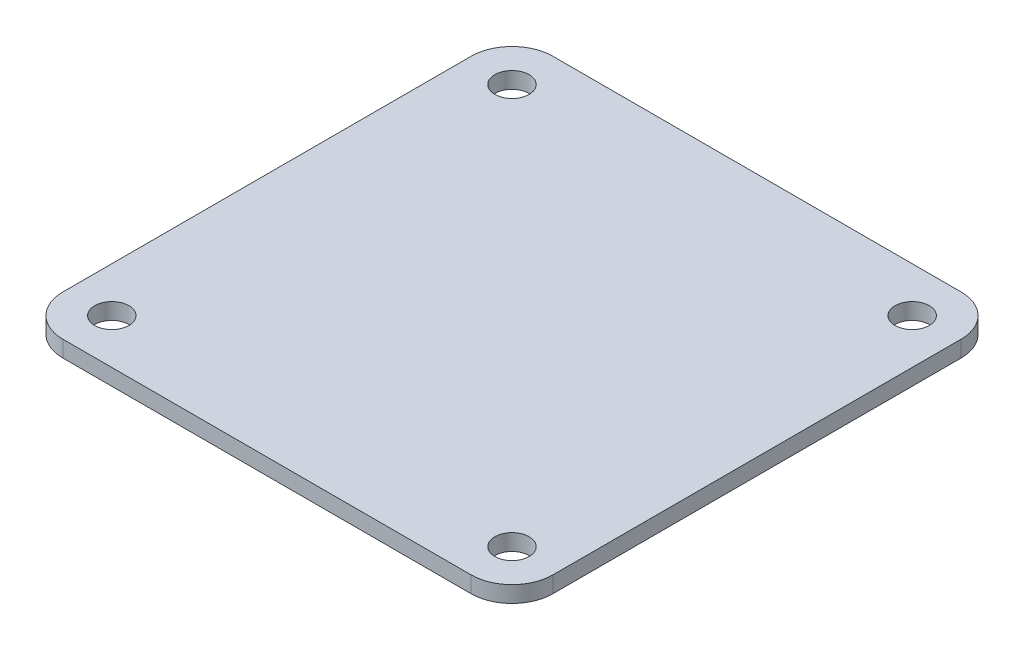
ISO-10303-21;
HEADER;
FILE_DESCRIPTION(('STEP AP214'),'2;1');
FILE_NAME('part.step','',(''),(''),'','','');
FILE_SCHEMA(('AUTOMOTIVE_DESIGN { 1 0 10303 214 1 1 1 1 }'));
ENDSEC;
DATA;
#1=APPLICATION_CONTEXT('core data for automotive mechanical design processes');
#2=APPLICATION_PROTOCOL_DEFINITION('international standard','automotive_design',2000,#1);
#3=PRODUCT_CONTEXT('',#1,'mechanical');
#4=PRODUCT('Part','Part','',(#3));
#5=PRODUCT_RELATED_PRODUCT_CATEGORY('part','',(#4));
#6=PRODUCT_DEFINITION_FORMATION('','',#4);
#7=PRODUCT_DEFINITION_CONTEXT('part definition',#1,'design');
#8=PRODUCT_DEFINITION('design','',#6,#7);
#9=PRODUCT_DEFINITION_SHAPE('','',#8);
#10=(LENGTH_UNIT() NAMED_UNIT(*) SI_UNIT(.MILLI.,.METRE.));
#11=(NAMED_UNIT(*) PLANE_ANGLE_UNIT() SI_UNIT($,.RADIAN.));
#12=(NAMED_UNIT(*) SI_UNIT($,.STERADIAN.) SOLID_ANGLE_UNIT());
#13=UNCERTAINTY_MEASURE_WITH_UNIT(LENGTH_MEASURE(1.E-05),#10,'distance_accuracy_value','');
#14=(GEOMETRIC_REPRESENTATION_CONTEXT(3) GLOBAL_UNCERTAINTY_ASSIGNED_CONTEXT((#13)) GLOBAL_UNIT_ASSIGNED_CONTEXT((#10,
#11,#12)) REPRESENTATION_CONTEXT('',''));
#15=CARTESIAN_POINT('',(0.,0.,0.));
#16=DIRECTION('',(0.,0.,1.));
#17=DIRECTION('',(1.,0.,0.));
#18=AXIS2_PLACEMENT_3D('',#15,#16,#17);
#19=CARTESIAN_POINT('',(12.5,1.,12.5));
#20=DIRECTION('',(0.,-1.,0.));
#21=DIRECTION('',(0.,0.,-1.));
#22=AXIS2_PLACEMENT_3D('',#19,#20,#21);
#23=CYLINDRICAL_SURFACE('',#22,2.5);
#24=CARTESIAN_POINT('',(12.5,0.,12.5));
#25=DIRECTION('',(0.,1.,0.));
#26=DIRECTION('',(0.,0.,1.));
#27=AXIS2_PLACEMENT_3D('',#24,#25,#26);
#28=CIRCLE('',#27,2.5);
#29=CARTESIAN_POINT('',(12.5,0.,15.));
#30=VERTEX_POINT('',#29);
#31=CARTESIAN_POINT('',(15.,0.,12.5));
#32=VERTEX_POINT('',#31);
#33=EDGE_CURVE('E142',#30,#32,#28,.T.);
#34=ORIENTED_EDGE('',*,*,#33,.T.);
#35=DIRECTION('',(0.,-1.,0.));
#36=VECTOR('',#35,1.);
#37=CARTESIAN_POINT('',(15.,1.,12.5));
#38=LINE('',#37,#36);
#39=CARTESIAN_POINT('',(15.,1.,12.5));
#40=VERTEX_POINT('',#39);
#41=EDGE_CURVE('E11',#40,#32,#38,.T.);
#42=ORIENTED_EDGE('',*,*,#41,.F.);
#43=CARTESIAN_POINT('',(12.5,1.,12.5));
#44=DIRECTION('',(0.,1.,0.));
#45=DIRECTION('',(0.,0.,1.));
#46=AXIS2_PLACEMENT_3D('',#43,#44,#45);
#47=CIRCLE('',#46,2.5);
#48=CARTESIAN_POINT('',(12.5,1.,15.));
#49=VERTEX_POINT('',#48);
#50=EDGE_CURVE('E187',#49,#40,#47,.T.);
#51=ORIENTED_EDGE('',*,*,#50,.F.);
#52=DIRECTION('',(0.,-1.,0.));
#53=VECTOR('',#52,1.);
#54=CARTESIAN_POINT('',(12.5,1.,15.));
#55=LINE('',#54,#53);
#56=EDGE_CURVE('E126',#49,#30,#55,.T.);
#57=ORIENTED_EDGE('',*,*,#56,.T.);
#58=EDGE_LOOP('',(#34,#42,#51,#57));
#59=FACE_BOUND('',#58,.T.);
#60=ADVANCED_FACE('F34',(#59),#23,.T.);
#61=CARTESIAN_POINT('',(15.,1.,0.));
#62=DIRECTION('',(-1.,0.,0.));
#63=DIRECTION('',(0.,0.,1.));
#64=AXIS2_PLACEMENT_3D('',#61,#62,#63);
#65=PLANE('',#64);
#66=DIRECTION('',(0.,0.,-1.));
#67=VECTOR('',#66,1.);
#68=CARTESIAN_POINT('',(15.,0.,0.));
#69=LINE('',#68,#67);
#70=CARTESIAN_POINT('',(15.,0.,-12.5));
#71=VERTEX_POINT('',#70);
#72=EDGE_CURVE('E145',#32,#71,#69,.T.);
#73=ORIENTED_EDGE('',*,*,#72,.T.);
#74=DIRECTION('',(0.,-1.,0.));
#75=VECTOR('',#74,1.);
#76=CARTESIAN_POINT('',(15.,1.,-12.5));
#77=LINE('',#76,#75);
#78=CARTESIAN_POINT('',(15.,1.,-12.5));
#79=VERTEX_POINT('',#78);
#80=EDGE_CURVE('E43',#79,#71,#77,.T.);
#81=ORIENTED_EDGE('',*,*,#80,.F.);
#82=DIRECTION('',(0.,0.,-1.));
#83=VECTOR('',#82,1.);
#84=CARTESIAN_POINT('',(15.,1.,0.));
#85=LINE('',#84,#83);
#86=EDGE_CURVE('E90',#40,#79,#85,.T.);
#87=ORIENTED_EDGE('',*,*,#86,.F.);
#88=ORIENTED_EDGE('',*,*,#41,.T.);
#89=EDGE_LOOP('',(#73,#81,#87,#88));
#90=FACE_BOUND('',#89,.T.);
#91=ADVANCED_FACE('F174',(#90),#65,.F.);
#92=CARTESIAN_POINT('',(12.5,1.,-12.5));
#93=DIRECTION('',(0.,-1.,0.));
#94=DIRECTION('',(0.,0.,-1.));
#95=AXIS2_PLACEMENT_3D('',#92,#93,#94);
#96=CYLINDRICAL_SURFACE('',#95,2.5);
#97=CARTESIAN_POINT('',(12.5,0.,-12.5));
#98=DIRECTION('',(0.,1.,0.));
#99=DIRECTION('',(0.,0.,1.));
#100=AXIS2_PLACEMENT_3D('',#97,#98,#99);
#101=CIRCLE('',#100,2.5);
#102=CARTESIAN_POINT('',(12.5,0.,-15.));
#103=VERTEX_POINT('',#102);
#104=EDGE_CURVE('E148',#103,#71,#101,.F.);
#105=ORIENTED_EDGE('',*,*,#104,.F.);
#106=DIRECTION('',(0.,-1.,0.));
#107=VECTOR('',#106,1.);
#108=CARTESIAN_POINT('',(12.5,1.,-15.));
#109=LINE('',#108,#107);
#110=CARTESIAN_POINT('',(12.5,1.,-15.));
#111=VERTEX_POINT('',#110);
#112=EDGE_CURVE('E167',#111,#103,#109,.T.);
#113=ORIENTED_EDGE('',*,*,#112,.F.);
#114=CARTESIAN_POINT('',(12.5,1.,-12.5));
#115=DIRECTION('',(0.,1.,0.));
#116=DIRECTION('',(0.,0.,1.));
#117=AXIS2_PLACEMENT_3D('',#114,#115,#116);
#118=CIRCLE('',#117,2.5);
#119=EDGE_CURVE('E173',#111,#79,#118,.F.);
#120=ORIENTED_EDGE('',*,*,#119,.T.);
#121=ORIENTED_EDGE('',*,*,#80,.T.);
#122=EDGE_LOOP('',(#105,#113,#120,#121));
#123=FACE_BOUND('',#122,.T.);
#124=ADVANCED_FACE('F171',(#123),#96,.T.);
#125=CARTESIAN_POINT('',(0.,1.,-15.));
#126=DIRECTION('',(0.,0.,-1.));
#127=DIRECTION('',(-1.,0.,0.));
#128=AXIS2_PLACEMENT_3D('',#125,#126,#127);
#129=PLANE('',#128);
#130=DIRECTION('',(1.,0.,0.));
#131=VECTOR('',#130,1.);
#132=CARTESIAN_POINT('',(0.,0.,-15.));
#133=LINE('',#132,#131);
#134=CARTESIAN_POINT('',(-12.5,0.,-15.));
#135=VERTEX_POINT('',#134);
#136=EDGE_CURVE('E151',#135,#103,#133,.T.);
#137=ORIENTED_EDGE('',*,*,#136,.F.);
#138=DIRECTION('',(0.,-1.,0.));
#139=VECTOR('',#138,1.);
#140=CARTESIAN_POINT('',(-12.5,1.,-15.));
#141=LINE('',#140,#139);
#142=CARTESIAN_POINT('',(-12.5,1.,-15.));
#143=VERTEX_POINT('',#142);
#144=EDGE_CURVE('E165',#143,#135,#141,.T.);
#145=ORIENTED_EDGE('',*,*,#144,.F.);
#146=DIRECTION('',(1.,0.,0.));
#147=VECTOR('',#146,1.);
#148=CARTESIAN_POINT('',(0.,1.,-15.));
#149=LINE('',#148,#147);
#150=EDGE_CURVE('E184',#143,#111,#149,.T.);
#151=ORIENTED_EDGE('',*,*,#150,.T.);
#152=ORIENTED_EDGE('',*,*,#112,.T.);
#153=EDGE_LOOP('',(#137,#145,#151,#152));
#154=FACE_BOUND('',#153,.T.);
#155=ADVANCED_FACE('F182',(#154),#129,.T.);
#156=CARTESIAN_POINT('',(-12.5,1.,-12.5));
#157=DIRECTION('',(0.,-1.,0.));
#158=DIRECTION('',(0.,0.,-1.));
#159=AXIS2_PLACEMENT_3D('',#156,#157,#158);
#160=CYLINDRICAL_SURFACE('',#159,2.5);
#161=CARTESIAN_POINT('',(-12.5,0.,-12.5));
#162=DIRECTION('',(0.,1.,0.));
#163=DIRECTION('',(0.,0.,1.));
#164=AXIS2_PLACEMENT_3D('',#161,#162,#163);
#165=CIRCLE('',#164,2.5);
#166=CARTESIAN_POINT('',(-15.,0.,-12.5));
#167=VERTEX_POINT('',#166);
#168=EDGE_CURVE('E154',#167,#135,#165,.F.);
#169=ORIENTED_EDGE('',*,*,#168,.F.);
#170=DIRECTION('',(0.,-1.,0.));
#171=VECTOR('',#170,1.);
#172=CARTESIAN_POINT('',(-15.,1.,-12.5));
#173=LINE('',#172,#171);
#174=CARTESIAN_POINT('',(-15.,1.,-12.5));
#175=VERTEX_POINT('',#174);
#176=EDGE_CURVE('E115',#175,#167,#173,.T.);
#177=ORIENTED_EDGE('',*,*,#176,.F.);
#178=CARTESIAN_POINT('',(-12.5,1.,-12.5));
#179=DIRECTION('',(0.,1.,0.));
#180=DIRECTION('',(0.,0.,1.));
#181=AXIS2_PLACEMENT_3D('',#178,#179,#180);
#182=CIRCLE('',#181,2.5);
#183=EDGE_CURVE('E122',#175,#143,#182,.F.);
#184=ORIENTED_EDGE('',*,*,#183,.T.);
#185=ORIENTED_EDGE('',*,*,#144,.T.);
#186=EDGE_LOOP('',(#169,#177,#184,#185));
#187=FACE_BOUND('',#186,.T.);
#188=ADVANCED_FACE('F191',(#187),#160,.T.);
#189=CARTESIAN_POINT('',(-15.,1.,0.));
#190=DIRECTION('',(-1.,0.,0.));
#191=DIRECTION('',(0.,0.,1.));
#192=AXIS2_PLACEMENT_3D('',#189,#190,#191);
#193=PLANE('',#192);
#194=DIRECTION('',(0.,0.,-1.));
#195=VECTOR('',#194,1.);
#196=CARTESIAN_POINT('',(-15.,0.,0.));
#197=LINE('',#196,#195);
#198=CARTESIAN_POINT('',(-15.,0.,12.5));
#199=VERTEX_POINT('',#198);
#200=EDGE_CURVE('E110',#199,#167,#197,.T.);
#201=ORIENTED_EDGE('',*,*,#200,.F.);
#202=DIRECTION('',(0.,-1.,0.));
#203=VECTOR('',#202,1.);
#204=CARTESIAN_POINT('',(-15.,1.,12.5));
#205=LINE('',#204,#203);
#206=CARTESIAN_POINT('',(-15.,1.,12.5));
#207=VERTEX_POINT('',#206);
#208=EDGE_CURVE('E105',#207,#199,#205,.T.);
#209=ORIENTED_EDGE('',*,*,#208,.F.);
#210=DIRECTION('',(0.,0.,-1.));
#211=VECTOR('',#210,1.);
#212=CARTESIAN_POINT('',(-15.,1.,0.));
#213=LINE('',#212,#211);
#214=EDGE_CURVE('E108',#207,#175,#213,.T.);
#215=ORIENTED_EDGE('',*,*,#214,.T.);
#216=ORIENTED_EDGE('',*,*,#176,.T.);
#217=EDGE_LOOP('',(#201,#209,#215,#216));
#218=FACE_BOUND('',#217,.T.);
#219=ADVANCED_FACE('F107',(#218),#193,.T.);
#220=CARTESIAN_POINT('',(-12.5,1.,12.5));
#221=DIRECTION('',(0.,-1.,0.));
#222=DIRECTION('',(0.,0.,-1.));
#223=AXIS2_PLACEMENT_3D('',#220,#221,#222);
#224=CYLINDRICAL_SURFACE('',#223,2.5);
#225=CARTESIAN_POINT('',(-12.5,0.,12.5));
#226=DIRECTION('',(0.,1.,0.));
#227=DIRECTION('',(0.,0.,1.));
#228=AXIS2_PLACEMENT_3D('',#225,#226,#227);
#229=CIRCLE('',#228,2.5);
#230=CARTESIAN_POINT('',(-12.5,0.,15.));
#231=VERTEX_POINT('',#230);
#232=EDGE_CURVE('E158',#231,#199,#229,.F.);
#233=ORIENTED_EDGE('',*,*,#232,.F.);
#234=DIRECTION('',(0.,-1.,0.));
#235=VECTOR('',#234,1.);
#236=CARTESIAN_POINT('',(-12.5,1.,15.));
#237=LINE('',#236,#235);
#238=CARTESIAN_POINT('',(-12.5,1.,15.));
#239=VERTEX_POINT('',#238);
#240=EDGE_CURVE('E79',#239,#231,#237,.T.);
#241=ORIENTED_EDGE('',*,*,#240,.F.);
#242=CARTESIAN_POINT('',(-12.5,1.,12.5));
#243=DIRECTION('',(0.,1.,0.));
#244=DIRECTION('',(0.,0.,1.));
#245=AXIS2_PLACEMENT_3D('',#242,#243,#244);
#246=CIRCLE('',#245,2.5);
#247=EDGE_CURVE('E119',#239,#207,#246,.F.);
#248=ORIENTED_EDGE('',*,*,#247,.T.);
#249=ORIENTED_EDGE('',*,*,#208,.T.);
#250=EDGE_LOOP('',(#233,#241,#248,#249));
#251=FACE_BOUND('',#250,.T.);
#252=ADVANCED_FACE('F124',(#251),#224,.T.);
#253=CARTESIAN_POINT('',(-12.25,1.,12.25));
#254=DIRECTION('',(0.,-1.,0.));
#255=DIRECTION('',(0.,0.,-1.));
#256=AXIS2_PLACEMENT_3D('',#253,#254,#255);
#257=CYLINDRICAL_SURFACE('',#256,1.05);
#258=CARTESIAN_POINT('',(-12.25,1.,12.25));
#259=DIRECTION('',(0.,1.,0.));
#260=DIRECTION('',(0.,0.,1.));
#261=AXIS2_PLACEMENT_3D('',#258,#259,#260);
#262=CIRCLE('',#261,1.05);
#263=CARTESIAN_POINT('',(-12.25,1.,13.3));
#264=VERTEX_POINT('',#263);
#265=EDGE_CURVE('E384',#264,#264,#262,.T.);
#266=ORIENTED_EDGE('',*,*,#265,.T.);
#267=EDGE_LOOP('',(#266));
#268=FACE_BOUND('',#267,.T.);
#269=CARTESIAN_POINT('',(-12.25,0.,12.25));
#270=DIRECTION('',(0.,1.,0.));
#271=DIRECTION('',(0.,0.,1.));
#272=AXIS2_PLACEMENT_3D('',#269,#270,#271);
#273=CIRCLE('',#272,1.05);
#274=CARTESIAN_POINT('',(-12.25,0.,13.3));
#275=VERTEX_POINT('',#274);
#276=EDGE_CURVE('E139',#275,#275,#273,.T.);
#277=ORIENTED_EDGE('',*,*,#276,.F.);
#278=EDGE_LOOP('',(#277));
#279=FACE_BOUND('',#278,.T.);
#280=ADVANCED_FACE('F215',(#268,#279),#257,.F.);
#281=CARTESIAN_POINT('',(-12.25,1.,-12.25));
#282=DIRECTION('',(0.,-1.,0.));
#283=DIRECTION('',(0.,0.,-1.));
#284=AXIS2_PLACEMENT_3D('',#281,#282,#283);
#285=CYLINDRICAL_SURFACE('',#284,1.05);
#286=CARTESIAN_POINT('',(-12.25,1.,-12.25));
#287=DIRECTION('',(0.,1.,0.));
#288=DIRECTION('',(0.,0.,1.));
#289=AXIS2_PLACEMENT_3D('',#286,#287,#288);
#290=CIRCLE('',#289,1.05);
#291=CARTESIAN_POINT('',(-12.25,1.,-11.2));
#292=VERTEX_POINT('',#291);
#293=EDGE_CURVE('E381',#292,#292,#290,.T.);
#294=ORIENTED_EDGE('',*,*,#293,.T.);
#295=EDGE_LOOP('',(#294));
#296=FACE_BOUND('',#295,.T.);
#297=CARTESIAN_POINT('',(-12.25,0.,-12.25));
#298=DIRECTION('',(0.,1.,0.));
#299=DIRECTION('',(0.,0.,1.));
#300=AXIS2_PLACEMENT_3D('',#297,#298,#299);
#301=CIRCLE('',#300,1.05);
#302=CARTESIAN_POINT('',(-12.25,0.,-11.2));
#303=VERTEX_POINT('',#302);
#304=EDGE_CURVE('E136',#303,#303,#301,.T.);
#305=ORIENTED_EDGE('',*,*,#304,.F.);
#306=EDGE_LOOP('',(#305));
#307=FACE_BOUND('',#306,.T.);
#308=ADVANCED_FACE('F218',(#296,#307),#285,.F.);
#309=CARTESIAN_POINT('',(12.25,1.,-12.25));
#310=DIRECTION('',(0.,-1.,0.));
#311=DIRECTION('',(0.,0.,-1.));
#312=AXIS2_PLACEMENT_3D('',#309,#310,#311);
#313=CYLINDRICAL_SURFACE('',#312,1.05);
#314=CARTESIAN_POINT('',(12.25,1.,-12.25));
#315=DIRECTION('',(0.,1.,0.));
#316=DIRECTION('',(0.,0.,1.));
#317=AXIS2_PLACEMENT_3D('',#314,#315,#316);
#318=CIRCLE('',#317,1.05);
#319=CARTESIAN_POINT('',(12.25,1.,-11.2));
#320=VERTEX_POINT('',#319);
#321=EDGE_CURVE('E229',#320,#320,#318,.T.);
#322=ORIENTED_EDGE('',*,*,#321,.T.);
#323=EDGE_LOOP('',(#322));
#324=FACE_BOUND('',#323,.T.);
#325=CARTESIAN_POINT('',(12.25,0.,-12.25));
#326=DIRECTION('',(0.,1.,0.));
#327=DIRECTION('',(0.,0.,1.));
#328=AXIS2_PLACEMENT_3D('',#325,#326,#327);
#329=CIRCLE('',#328,1.05);
#330=CARTESIAN_POINT('',(12.25,0.,-11.2));
#331=VERTEX_POINT('',#330);
#332=EDGE_CURVE('E133',#331,#331,#329,.T.);
#333=ORIENTED_EDGE('',*,*,#332,.F.);
#334=EDGE_LOOP('',(#333));
#335=FACE_BOUND('',#334,.T.);
#336=ADVANCED_FACE('F203',(#324,#335),#313,.F.);
#337=CARTESIAN_POINT('',(12.25,1.,12.25));
#338=DIRECTION('',(0.,-1.,0.));
#339=DIRECTION('',(0.,0.,-1.));
#340=AXIS2_PLACEMENT_3D('',#337,#338,#339);
#341=CYLINDRICAL_SURFACE('',#340,1.05);
#342=CARTESIAN_POINT('',(12.25,1.,12.25));
#343=DIRECTION('',(0.,1.,0.));
#344=DIRECTION('',(0.,0.,1.));
#345=AXIS2_PLACEMENT_3D('',#342,#343,#344);
#346=CIRCLE('',#345,1.05);
#347=CARTESIAN_POINT('',(12.25,1.,13.3));
#348=VERTEX_POINT('',#347);
#349=EDGE_CURVE('E161',#348,#348,#346,.T.);
#350=ORIENTED_EDGE('',*,*,#349,.T.);
#351=EDGE_LOOP('',(#350));
#352=FACE_BOUND('',#351,.T.);
#353=CARTESIAN_POINT('',(12.25,0.,12.25));
#354=DIRECTION('',(0.,1.,0.));
#355=DIRECTION('',(0.,0.,1.));
#356=AXIS2_PLACEMENT_3D('',#353,#354,#355);
#357=CIRCLE('',#356,1.05);
#358=CARTESIAN_POINT('',(12.25,0.,13.3));
#359=VERTEX_POINT('',#358);
#360=EDGE_CURVE('E130',#359,#359,#357,.T.);
#361=ORIENTED_EDGE('',*,*,#360,.F.);
#362=EDGE_LOOP('',(#361));
#363=FACE_BOUND('',#362,.T.);
#364=ADVANCED_FACE('F36',(#352,#363),#341,.F.);
#365=CARTESIAN_POINT('',(0.,1.,15.));
#366=DIRECTION('',(0.,0.,-1.));
#367=DIRECTION('',(-1.,0.,0.));
#368=AXIS2_PLACEMENT_3D('',#365,#366,#367);
#369=PLANE('',#368);
#370=DIRECTION('',(1.,0.,0.));
#371=VECTOR('',#370,1.);
#372=CARTESIAN_POINT('',(0.,0.,15.));
#373=LINE('',#372,#371);
#374=EDGE_CURVE('E82',#231,#30,#373,.T.);
#375=ORIENTED_EDGE('',*,*,#374,.T.);
#376=ORIENTED_EDGE('',*,*,#56,.F.);
#377=DIRECTION('',(1.,0.,0.));
#378=VECTOR('',#377,1.);
#379=CARTESIAN_POINT('',(0.,1.,15.));
#380=LINE('',#379,#378);
#381=EDGE_CURVE('E51',#239,#49,#380,.T.);
#382=ORIENTED_EDGE('',*,*,#381,.F.);
#383=ORIENTED_EDGE('',*,*,#240,.T.);
#384=EDGE_LOOP('',(#375,#376,#382,#383));
#385=FACE_BOUND('',#384,.T.);
#386=ADVANCED_FACE('F194',(#385),#369,.F.);
#387=CARTESIAN_POINT('',(0.,1.,0.));
#388=DIRECTION('',(0.,1.,0.));
#389=DIRECTION('',(0.,0.,1.));
#390=AXIS2_PLACEMENT_3D('',#387,#388,#389);
#391=PLANE('',#390);
#392=ORIENTED_EDGE('',*,*,#349,.F.);
#393=EDGE_LOOP('',(#392));
#394=FACE_BOUND('',#393,.T.);
#395=ORIENTED_EDGE('',*,*,#321,.F.);
#396=EDGE_LOOP('',(#395));
#397=FACE_BOUND('',#396,.T.);
#398=ORIENTED_EDGE('',*,*,#293,.F.);
#399=EDGE_LOOP('',(#398));
#400=FACE_BOUND('',#399,.T.);
#401=ORIENTED_EDGE('',*,*,#265,.F.);
#402=EDGE_LOOP('',(#401));
#403=FACE_BOUND('',#402,.T.);
#404=ORIENTED_EDGE('',*,*,#50,.T.);
#405=ORIENTED_EDGE('',*,*,#86,.T.);
#406=ORIENTED_EDGE('',*,*,#119,.F.);
#407=ORIENTED_EDGE('',*,*,#150,.F.);
#408=ORIENTED_EDGE('',*,*,#183,.F.);
#409=ORIENTED_EDGE('',*,*,#214,.F.);
#410=ORIENTED_EDGE('',*,*,#247,.F.);
#411=ORIENTED_EDGE('',*,*,#381,.T.);
#412=EDGE_LOOP('',(#404,#405,#406,#407,#408,#409,#410,#411));
#413=FACE_BOUND('',#412,.T.);
#414=ADVANCED_FACE('F118',(#394,#397,#400,#403,#413),#391,.T.);
#415=CARTESIAN_POINT('',(0.,0.,0.));
#416=DIRECTION('',(0.,1.,0.));
#417=DIRECTION('',(0.,0.,1.));
#418=AXIS2_PLACEMENT_3D('',#415,#416,#417);
#419=PLANE('',#418);
#420=ORIENTED_EDGE('',*,*,#360,.T.);
#421=EDGE_LOOP('',(#420));
#422=FACE_BOUND('',#421,.T.);
#423=ORIENTED_EDGE('',*,*,#332,.T.);
#424=EDGE_LOOP('',(#423));
#425=FACE_BOUND('',#424,.T.);
#426=ORIENTED_EDGE('',*,*,#304,.T.);
#427=EDGE_LOOP('',(#426));
#428=FACE_BOUND('',#427,.T.);
#429=ORIENTED_EDGE('',*,*,#276,.T.);
#430=EDGE_LOOP('',(#429));
#431=FACE_BOUND('',#430,.T.);
#432=ORIENTED_EDGE('',*,*,#33,.F.);
#433=ORIENTED_EDGE('',*,*,#374,.F.);
#434=ORIENTED_EDGE('',*,*,#232,.T.);
#435=ORIENTED_EDGE('',*,*,#200,.T.);
#436=ORIENTED_EDGE('',*,*,#168,.T.);
#437=ORIENTED_EDGE('',*,*,#136,.T.);
#438=ORIENTED_EDGE('',*,*,#104,.T.);
#439=ORIENTED_EDGE('',*,*,#72,.F.);
#440=EDGE_LOOP('',(#432,#433,#434,#435,#436,#437,#438,#439));
#441=FACE_BOUND('',#440,.T.);
#442=ADVANCED_FACE('F178',(#422,#425,#428,#431,#441),#419,.F.);
#443=CLOSED_SHELL('',(#60,#91,#124,#155,#188,#219,#252,#280,#308,#336,#364,#386,#414,#442));
#444=MANIFOLD_SOLID_BREP('B2',#443);
#445=ADVANCED_BREP_SHAPE_REPRESENTATION('',(#18,#444),#14);
#446=SHAPE_DEFINITION_REPRESENTATION(#9,#445);
ENDSEC;
END-ISO-10303-21;
